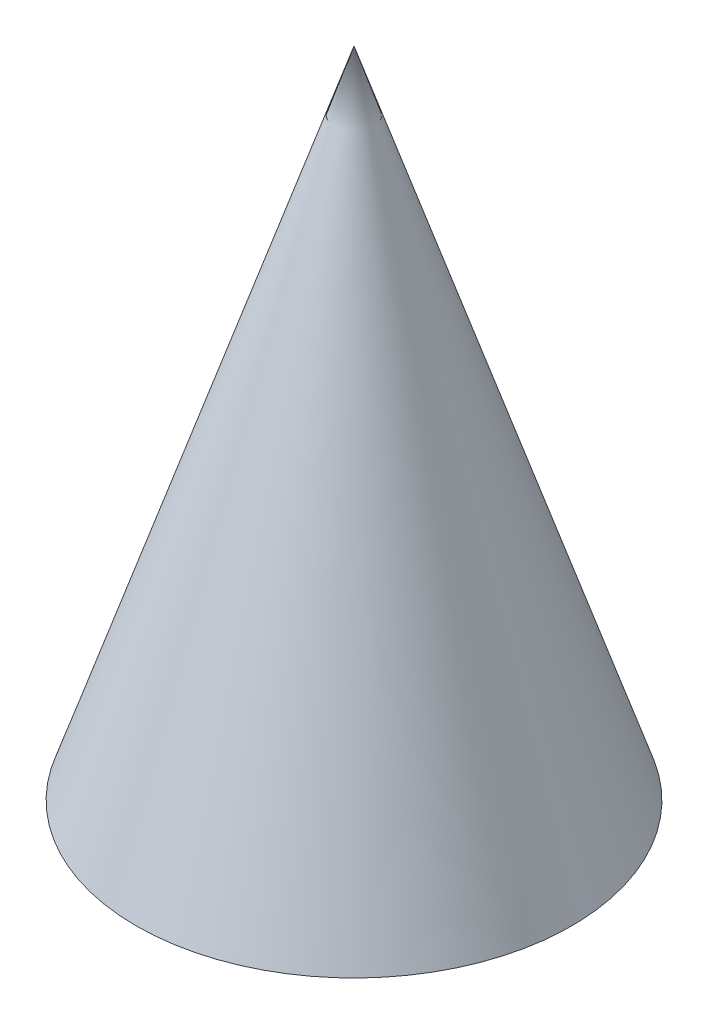
ISO-10303-21;
HEADER;
FILE_DESCRIPTION(('STEP AP214'),'2;1');
FILE_NAME('part.step','',(''),(''),'','','');
FILE_SCHEMA(('AUTOMOTIVE_DESIGN { 1 0 10303 214 1 1 1 1 }'));
ENDSEC;
DATA;
#1=APPLICATION_CONTEXT('core data for automotive mechanical design processes');
#2=APPLICATION_PROTOCOL_DEFINITION('international standard','automotive_design',2000,#1);
#3=PRODUCT_CONTEXT('',#1,'mechanical');
#4=PRODUCT('Part','Part','',(#3));
#5=PRODUCT_RELATED_PRODUCT_CATEGORY('part','',(#4));
#6=PRODUCT_DEFINITION_FORMATION('','',#4);
#7=PRODUCT_DEFINITION_CONTEXT('part definition',#1,'design');
#8=PRODUCT_DEFINITION('design','',#6,#7);
#9=PRODUCT_DEFINITION_SHAPE('','',#8);
#10=(LENGTH_UNIT() NAMED_UNIT(*) SI_UNIT(.MILLI.,.METRE.));
#11=(NAMED_UNIT(*) PLANE_ANGLE_UNIT() SI_UNIT($,.RADIAN.));
#12=(NAMED_UNIT(*) SI_UNIT($,.STERADIAN.) SOLID_ANGLE_UNIT());
#13=UNCERTAINTY_MEASURE_WITH_UNIT(LENGTH_MEASURE(1.E-05),#10,'distance_accuracy_value','');
#14=(GEOMETRIC_REPRESENTATION_CONTEXT(3) GLOBAL_UNCERTAINTY_ASSIGNED_CONTEXT((#13)) GLOBAL_UNIT_ASSIGNED_CONTEXT((#10,
#11,#12)) REPRESENTATION_CONTEXT('',''));
#15=CARTESIAN_POINT('',(0.,0.,0.));
#16=DIRECTION('',(0.,0.,1.));
#17=DIRECTION('',(1.,0.,0.));
#18=AXIS2_PLACEMENT_3D('',#15,#16,#17);
#19=CARTESIAN_POINT('',(25.4,0.,0.));
#20=DIRECTION('',(0.,-1.,0.));
#21=DIRECTION('',(0.,0.,-1.));
#22=AXIS2_PLACEMENT_3D('',#19,#20,#21);
#23=PLANE('',#22);
#24=CARTESIAN_POINT('',(0.,0.,0.));
#25=DIRECTION('',(0.,-1.,0.));
#26=DIRECTION('',(0.,0.,-1.));
#27=AXIS2_PLACEMENT_3D('',#24,#25,#26);
#28=CIRCLE('',#27,25.4);
#29=CARTESIAN_POINT('',(0.,0.,-25.4));
#30=VERTEX_POINT('',#29);
#31=EDGE_CURVE('E11',#30,#30,#28,.T.);
#32=ORIENTED_EDGE('',*,*,#31,.T.);
#33=EDGE_LOOP('',(#32));
#34=FACE_BOUND('',#33,.T.);
#35=ADVANCED_FACE('F43',(#34),#23,.T.);
#36=CARTESIAN_POINT('',(0.,0.,0.));
#37=DIRECTION('',(0.,-1.,0.));
#38=DIRECTION('',(0.,0.,-1.));
#39=AXIS2_PLACEMENT_3D('',#36,#37,#38);
#40=CONICAL_SURFACE('',#39,25.4,0.321750554396642);
#41=CARTESIAN_POINT('',(0.,76.2,0.));
#42=VERTEX_POINT('',#41);
#43=VERTEX_LOOP('',#42);
#44=FACE_BOUND('',#43,.T.);
#45=ORIENTED_EDGE('',*,*,#31,.F.);
#46=EDGE_LOOP('',(#45));
#47=FACE_BOUND('',#46,.T.);
#48=ADVANCED_FACE('F51',(#44,#47),#40,.T.);
#49=CLOSED_SHELL('',(#35,#48));
#50=MANIFOLD_SOLID_BREP('B2',#49);
#51=ADVANCED_BREP_SHAPE_REPRESENTATION('',(#18,#50),#14);
#52=SHAPE_DEFINITION_REPRESENTATION(#9,#51);
ENDSEC;
END-ISO-10303-21;
